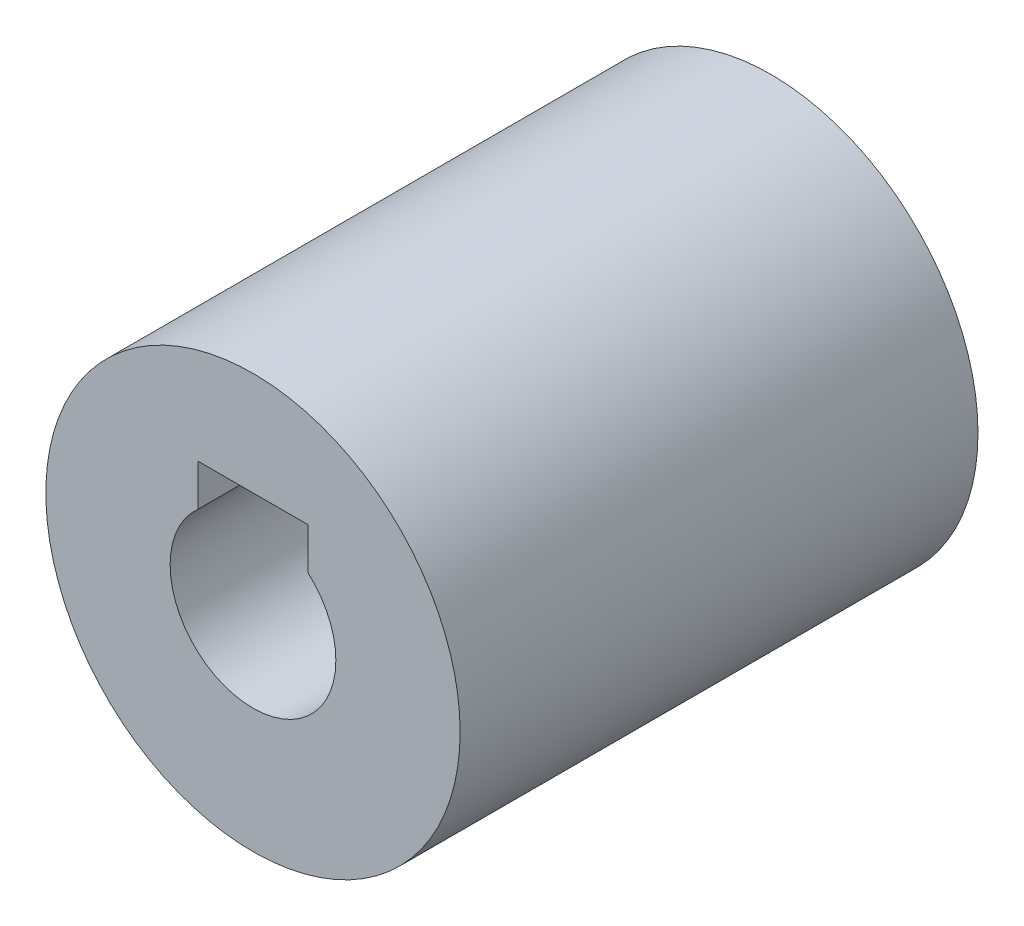
ISO-10303-21;
HEADER;
FILE_DESCRIPTION(('STEP AP214'),'2;1');
FILE_NAME('part.step','',(''),(''),'','','');
FILE_SCHEMA(('AUTOMOTIVE_DESIGN { 1 0 10303 214 1 1 1 1 }'));
ENDSEC;
DATA;
#1=APPLICATION_CONTEXT('core data for automotive mechanical design processes');
#2=APPLICATION_PROTOCOL_DEFINITION('international standard','automotive_design',2000,#1);
#3=PRODUCT_CONTEXT('',#1,'mechanical');
#4=PRODUCT('Part','Part','',(#3));
#5=PRODUCT_RELATED_PRODUCT_CATEGORY('part','',(#4));
#6=PRODUCT_DEFINITION_FORMATION('','',#4);
#7=PRODUCT_DEFINITION_CONTEXT('part definition',#1,'design');
#8=PRODUCT_DEFINITION('design','',#6,#7);
#9=PRODUCT_DEFINITION_SHAPE('','',#8);
#10=(LENGTH_UNIT() NAMED_UNIT(*) SI_UNIT(.MILLI.,.METRE.));
#11=(NAMED_UNIT(*) PLANE_ANGLE_UNIT() SI_UNIT($,.RADIAN.));
#12=(NAMED_UNIT(*) SI_UNIT($,.STERADIAN.) SOLID_ANGLE_UNIT());
#13=UNCERTAINTY_MEASURE_WITH_UNIT(LENGTH_MEASURE(1.E-05),#10,'distance_accuracy_value','');
#14=(GEOMETRIC_REPRESENTATION_CONTEXT(3) GLOBAL_UNCERTAINTY_ASSIGNED_CONTEXT((#13)) GLOBAL_UNIT_ASSIGNED_CONTEXT((#10,
#11,#12)) REPRESENTATION_CONTEXT('',''));
#15=CARTESIAN_POINT('',(0.,0.,0.));
#16=DIRECTION('',(0.,0.,1.));
#17=DIRECTION('',(1.,0.,0.));
#18=AXIS2_PLACEMENT_3D('',#15,#16,#17);
#19=CARTESIAN_POINT('',(0.,0.,25.));
#20=DIRECTION('',(0.,0.,-1.));
#21=DIRECTION('',(-1.,0.,0.));
#22=AXIS2_PLACEMENT_3D('',#19,#20,#21);
#23=CYLINDRICAL_SURFACE('',#22,4.);
#24=CARTESIAN_POINT('',(0.,0.,0.));
#25=DIRECTION('',(0.,0.,1.));
#26=DIRECTION('',(1.,0.,0.));
#27=AXIS2_PLACEMENT_3D('',#24,#25,#26);
#28=CIRCLE('',#27,4.);
#29=CARTESIAN_POINT('',(-2.64575131106459,3.,0.));
#30=VERTEX_POINT('',#29);
#31=CARTESIAN_POINT('',(2.64575131106459,3.,0.));
#32=VERTEX_POINT('',#31);
#33=EDGE_CURVE('E114',#30,#32,#28,.T.);
#34=ORIENTED_EDGE('',*,*,#33,.F.);
#35=DIRECTION('',(0.,0.,-1.));
#36=VECTOR('',#35,1.);
#37=CARTESIAN_POINT('',(-2.64575131106459,3.,25.));
#38=LINE('',#37,#36);
#39=CARTESIAN_POINT('',(-2.64575131106459,3.,25.));
#40=VERTEX_POINT('',#39);
#41=EDGE_CURVE('E11',#40,#30,#38,.T.);
#42=ORIENTED_EDGE('',*,*,#41,.F.);
#43=CARTESIAN_POINT('',(0.,0.,25.));
#44=DIRECTION('',(0.,0.,1.));
#45=DIRECTION('',(1.,0.,0.));
#46=AXIS2_PLACEMENT_3D('',#43,#44,#45);
#47=CIRCLE('',#46,4.);
#48=CARTESIAN_POINT('',(2.64575131106459,3.,25.));
#49=VERTEX_POINT('',#48);
#50=EDGE_CURVE('E91',#40,#49,#47,.T.);
#51=ORIENTED_EDGE('',*,*,#50,.T.);
#52=DIRECTION('',(0.,0.,-1.));
#53=VECTOR('',#52,1.);
#54=CARTESIAN_POINT('',(2.64575131106459,3.,25.));
#55=LINE('',#54,#53);
#56=EDGE_CURVE('E58',#49,#32,#55,.T.);
#57=ORIENTED_EDGE('',*,*,#56,.T.);
#58=EDGE_LOOP('',(#34,#42,#51,#57));
#59=FACE_BOUND('',#58,.T.);
#60=ADVANCED_FACE('F41',(#59),#23,.F.);
#61=CARTESIAN_POINT('',(-2.64575131106459,0.,25.));
#62=DIRECTION('',(-1.,0.,0.));
#63=DIRECTION('',(0.,-1.,0.));
#64=AXIS2_PLACEMENT_3D('',#61,#62,#63);
#65=PLANE('',#64);
#66=DIRECTION('',(0.,1.,0.));
#67=VECTOR('',#66,1.);
#68=CARTESIAN_POINT('',(-2.64575131106459,0.,0.));
#69=LINE('',#68,#67);
#70=CARTESIAN_POINT('',(-2.64575131106459,5.,0.));
#71=VERTEX_POINT('',#70);
#72=EDGE_CURVE('E98',#30,#71,#69,.T.);
#73=ORIENTED_EDGE('',*,*,#72,.T.);
#74=DIRECTION('',(0.,0.,-1.));
#75=VECTOR('',#74,1.);
#76=CARTESIAN_POINT('',(-2.64575131106459,5.,25.));
#77=LINE('',#76,#75);
#78=CARTESIAN_POINT('',(-2.64575131106459,5.,25.));
#79=VERTEX_POINT('',#78);
#80=EDGE_CURVE('E50',#79,#71,#77,.T.);
#81=ORIENTED_EDGE('',*,*,#80,.F.);
#82=DIRECTION('',(0.,1.,0.));
#83=VECTOR('',#82,1.);
#84=CARTESIAN_POINT('',(-2.64575131106459,0.,25.));
#85=LINE('',#84,#83);
#86=EDGE_CURVE('E84',#40,#79,#85,.T.);
#87=ORIENTED_EDGE('',*,*,#86,.F.);
#88=ORIENTED_EDGE('',*,*,#41,.T.);
#89=EDGE_LOOP('',(#73,#81,#87,#88));
#90=FACE_BOUND('',#89,.T.);
#91=ADVANCED_FACE('F96',(#90),#65,.F.);
#92=CARTESIAN_POINT('',(0.,5.,25.));
#93=DIRECTION('',(0.,1.,0.));
#94=DIRECTION('',(0.,0.,1.));
#95=AXIS2_PLACEMENT_3D('',#92,#93,#94);
#96=PLANE('',#95);
#97=DIRECTION('',(1.,0.,0.));
#98=VECTOR('',#97,1.);
#99=CARTESIAN_POINT('',(0.,5.,0.));
#100=LINE('',#99,#98);
#101=CARTESIAN_POINT('',(2.64575131106459,5.,0.));
#102=VERTEX_POINT('',#101);
#103=EDGE_CURVE('E119',#71,#102,#100,.T.);
#104=ORIENTED_EDGE('',*,*,#103,.T.);
#105=DIRECTION('',(0.,0.,-1.));
#106=VECTOR('',#105,1.);
#107=CARTESIAN_POINT('',(2.64575131106459,5.,25.));
#108=LINE('',#107,#106);
#109=CARTESIAN_POINT('',(2.64575131106459,5.,25.));
#110=VERTEX_POINT('',#109);
#111=EDGE_CURVE('E72',#110,#102,#108,.T.);
#112=ORIENTED_EDGE('',*,*,#111,.F.);
#113=DIRECTION('',(1.,0.,0.));
#114=VECTOR('',#113,1.);
#115=CARTESIAN_POINT('',(0.,5.,25.));
#116=LINE('',#115,#114);
#117=EDGE_CURVE('E90',#79,#110,#116,.T.);
#118=ORIENTED_EDGE('',*,*,#117,.F.);
#119=ORIENTED_EDGE('',*,*,#80,.T.);
#120=EDGE_LOOP('',(#104,#112,#118,#119));
#121=FACE_BOUND('',#120,.T.);
#122=ADVANCED_FACE('F102',(#121),#96,.F.);
#123=CARTESIAN_POINT('',(2.64575131106459,0.,25.));
#124=DIRECTION('',(-1.,0.,0.));
#125=DIRECTION('',(0.,-1.,0.));
#126=AXIS2_PLACEMENT_3D('',#123,#124,#125);
#127=PLANE('',#126);
#128=DIRECTION('',(0.,1.,0.));
#129=VECTOR('',#128,1.);
#130=CARTESIAN_POINT('',(2.64575131106459,0.,0.));
#131=LINE('',#130,#129);
#132=EDGE_CURVE('E122',#32,#102,#131,.T.);
#133=ORIENTED_EDGE('',*,*,#132,.F.);
#134=ORIENTED_EDGE('',*,*,#56,.F.);
#135=DIRECTION('',(0.,1.,0.));
#136=VECTOR('',#135,1.);
#137=CARTESIAN_POINT('',(2.64575131106459,0.,25.));
#138=LINE('',#137,#136);
#139=EDGE_CURVE('E104',#49,#110,#138,.T.);
#140=ORIENTED_EDGE('',*,*,#139,.T.);
#141=ORIENTED_EDGE('',*,*,#111,.T.);
#142=EDGE_LOOP('',(#133,#134,#140,#141));
#143=FACE_BOUND('',#142,.T.);
#144=ADVANCED_FACE('F136',(#143),#127,.T.);
#145=CARTESIAN_POINT('',(0.,0.,25.));
#146=DIRECTION('',(0.,0.,-1.));
#147=DIRECTION('',(-1.,0.,0.));
#148=AXIS2_PLACEMENT_3D('',#145,#146,#147);
#149=CYLINDRICAL_SURFACE('',#148,10.);
#150=CARTESIAN_POINT('',(0.,0.,25.));
#151=DIRECTION('',(0.,0.,1.));
#152=DIRECTION('',(1.,0.,0.));
#153=AXIS2_PLACEMENT_3D('',#150,#151,#152);
#154=CIRCLE('',#153,10.);
#155=CARTESIAN_POINT('',(10.,0.,25.));
#156=VERTEX_POINT('',#155);
#157=EDGE_CURVE('E107',#156,#156,#154,.T.);
#158=ORIENTED_EDGE('',*,*,#157,.F.);
#159=EDGE_LOOP('',(#158));
#160=FACE_BOUND('',#159,.T.);
#161=CARTESIAN_POINT('',(0.,0.,0.));
#162=DIRECTION('',(0.,0.,1.));
#163=DIRECTION('',(1.,0.,0.));
#164=AXIS2_PLACEMENT_3D('',#161,#162,#163);
#165=CIRCLE('',#164,10.);
#166=CARTESIAN_POINT('',(10.,0.,0.));
#167=VERTEX_POINT('',#166);
#168=EDGE_CURVE('E126',#167,#167,#165,.T.);
#169=ORIENTED_EDGE('',*,*,#168,.T.);
#170=EDGE_LOOP('',(#169));
#171=FACE_BOUND('',#170,.T.);
#172=ADVANCED_FACE('F138',(#160,#171),#149,.T.);
#173=CARTESIAN_POINT('',(0.,0.,25.));
#174=DIRECTION('',(0.,0.,1.));
#175=DIRECTION('',(1.,0.,0.));
#176=AXIS2_PLACEMENT_3D('',#173,#174,#175);
#177=PLANE('',#176);
#178=ORIENTED_EDGE('',*,*,#50,.F.);
#179=ORIENTED_EDGE('',*,*,#86,.T.);
#180=ORIENTED_EDGE('',*,*,#117,.T.);
#181=ORIENTED_EDGE('',*,*,#139,.F.);
#182=EDGE_LOOP('',(#178,#179,#180,#181));
#183=FACE_BOUND('',#182,.T.);
#184=ORIENTED_EDGE('',*,*,#157,.T.);
#185=EDGE_LOOP('',(#184));
#186=FACE_BOUND('',#185,.T.);
#187=ADVANCED_FACE('F86',(#183,#186),#177,.T.);
#188=CARTESIAN_POINT('',(0.,0.,0.));
#189=DIRECTION('',(0.,0.,1.));
#190=DIRECTION('',(1.,0.,0.));
#191=AXIS2_PLACEMENT_3D('',#188,#189,#190);
#192=PLANE('',#191);
#193=ORIENTED_EDGE('',*,*,#33,.T.);
#194=ORIENTED_EDGE('',*,*,#132,.T.);
#195=ORIENTED_EDGE('',*,*,#103,.F.);
#196=ORIENTED_EDGE('',*,*,#72,.F.);
#197=EDGE_LOOP('',(#193,#194,#195,#196));
#198=FACE_BOUND('',#197,.T.);
#199=ORIENTED_EDGE('',*,*,#168,.F.);
#200=EDGE_LOOP('',(#199));
#201=FACE_BOUND('',#200,.T.);
#202=ADVANCED_FACE('F176',(#198,#201),#192,.F.);
#203=CLOSED_SHELL('',(#60,#91,#122,#144,#172,#187,#202));
#204=MANIFOLD_SOLID_BREP('B2',#203);
#205=ADVANCED_BREP_SHAPE_REPRESENTATION('',(#18,#204),#14);
#206=SHAPE_DEFINITION_REPRESENTATION(#9,#205);
ENDSEC;
END-ISO-10303-21;
